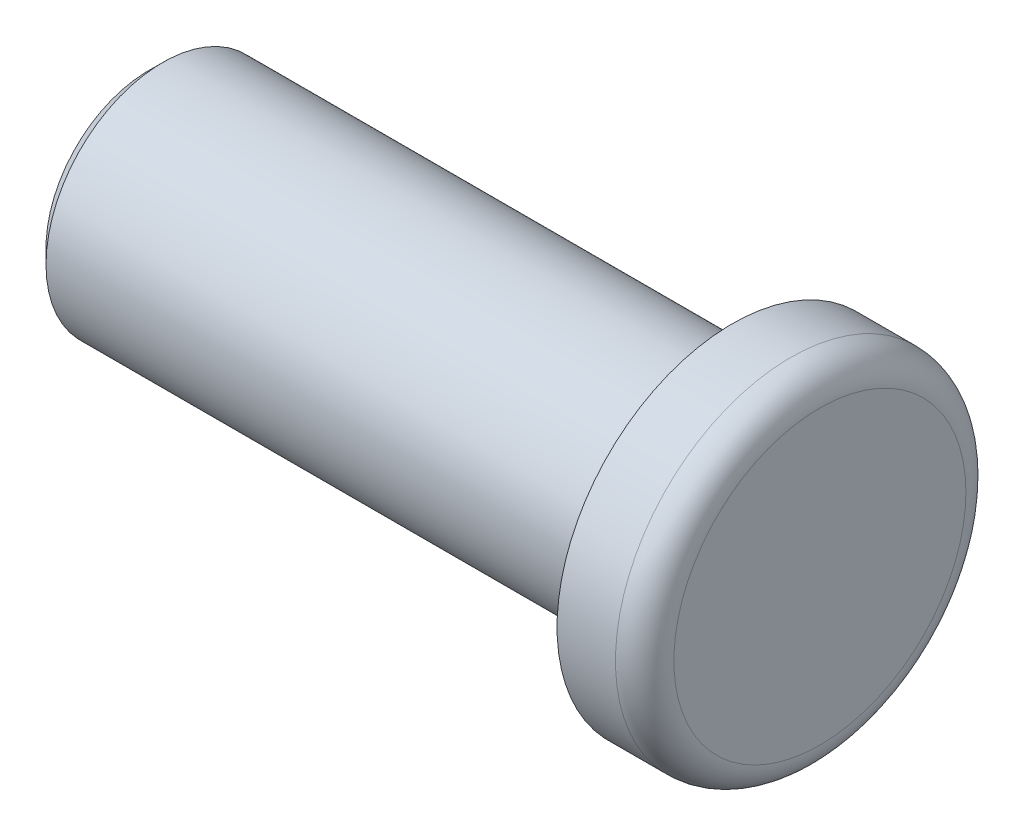
ISO-10303-21;
HEADER;
FILE_DESCRIPTION(('STEP AP214'),'2;1');
FILE_NAME('part.step','',(''),(''),'','','');
FILE_SCHEMA(('AUTOMOTIVE_DESIGN { 1 0 10303 214 1 1 1 1 }'));
ENDSEC;
DATA;
#1=APPLICATION_CONTEXT('core data for automotive mechanical design processes');
#2=APPLICATION_PROTOCOL_DEFINITION('international standard','automotive_design',2000,#1);
#3=PRODUCT_CONTEXT('',#1,'mechanical');
#4=PRODUCT('Part','Part','',(#3));
#5=PRODUCT_RELATED_PRODUCT_CATEGORY('part','',(#4));
#6=PRODUCT_DEFINITION_FORMATION('','',#4);
#7=PRODUCT_DEFINITION_CONTEXT('part definition',#1,'design');
#8=PRODUCT_DEFINITION('design','',#6,#7);
#9=PRODUCT_DEFINITION_SHAPE('','',#8);
#10=(LENGTH_UNIT() NAMED_UNIT(*) SI_UNIT(.MILLI.,.METRE.));
#11=(NAMED_UNIT(*) PLANE_ANGLE_UNIT() SI_UNIT($,.RADIAN.));
#12=(NAMED_UNIT(*) SI_UNIT($,.STERADIAN.) SOLID_ANGLE_UNIT());
#13=UNCERTAINTY_MEASURE_WITH_UNIT(LENGTH_MEASURE(1.E-05),#10,'distance_accuracy_value','');
#14=(GEOMETRIC_REPRESENTATION_CONTEXT(3) GLOBAL_UNCERTAINTY_ASSIGNED_CONTEXT((#13)) GLOBAL_UNIT_ASSIGNED_CONTEXT((#10,
#11,#12)) REPRESENTATION_CONTEXT('',''));
#15=CARTESIAN_POINT('',(0.,0.,0.));
#16=DIRECTION('',(0.,0.,1.));
#17=DIRECTION('',(1.,0.,0.));
#18=AXIS2_PLACEMENT_3D('',#15,#16,#17);
#19=CARTESIAN_POINT('',(3.,0.,0.));
#20=DIRECTION('',(1.,0.,0.));
#21=DIRECTION('',(0.,0.,-1.));
#22=AXIS2_PLACEMENT_3D('',#19,#20,#21);
#23=PLANE('',#22);
#24=CARTESIAN_POINT('',(3.,0.,0.));
#25=DIRECTION('',(1.,0.,0.));
#26=DIRECTION('',(0.,0.,-1.));
#27=AXIS2_PLACEMENT_3D('',#24,#25,#26);
#28=CIRCLE('',#27,5.);
#29=CARTESIAN_POINT('',(3.,0.,-5.));
#30=VERTEX_POINT('',#29);
#31=EDGE_CURVE('E64',#30,#30,#28,.T.);
#32=ORIENTED_EDGE('',*,*,#31,.T.);
#33=EDGE_LOOP('',(#32));
#34=FACE_BOUND('',#33,.T.);
#35=ADVANCED_FACE('F45',(#34),#23,.T.);
#36=CARTESIAN_POINT('',(0.,0.,0.));
#37=DIRECTION('',(1.,0.,0.));
#38=DIRECTION('',(0.,0.,-1.));
#39=AXIS2_PLACEMENT_3D('',#36,#37,#38);
#40=PLANE('',#39);
#41=CARTESIAN_POINT('',(0.,0.,0.));
#42=DIRECTION('',(1.,0.,0.));
#43=DIRECTION('',(0.,0.,-1.));
#44=AXIS2_PLACEMENT_3D('',#41,#42,#43);
#45=CIRCLE('',#44,6.);
#46=CARTESIAN_POINT('',(0.,0.,-6.));
#47=VERTEX_POINT('',#46);
#48=EDGE_CURVE('E70',#47,#47,#45,.T.);
#49=ORIENTED_EDGE('',*,*,#48,.F.);
#50=EDGE_LOOP('',(#49));
#51=FACE_BOUND('',#50,.T.);
#52=CARTESIAN_POINT('',(0.,0.,0.));
#53=DIRECTION('',(1.,0.,0.));
#54=DIRECTION('',(0.,0.,-1.));
#55=AXIS2_PLACEMENT_3D('',#52,#53,#54);
#56=CIRCLE('',#55,4.);
#57=CARTESIAN_POINT('',(0.,0.,-4.));
#58=VERTEX_POINT('',#57);
#59=EDGE_CURVE('E74',#58,#58,#56,.T.);
#60=ORIENTED_EDGE('',*,*,#59,.T.);
#61=EDGE_LOOP('',(#60));
#62=FACE_BOUND('',#61,.T.);
#63=ADVANCED_FACE('F79',(#51,#62),#40,.F.);
#64=CARTESIAN_POINT('',(3.,0.,0.));
#65=DIRECTION('',(-1.,0.,0.));
#66=DIRECTION('',(0.,0.,1.));
#67=AXIS2_PLACEMENT_3D('',#64,#65,#66);
#68=CYLINDRICAL_SURFACE('',#67,6.);
#69=CARTESIAN_POINT('',(2.,0.,0.));
#70=DIRECTION('',(1.,0.,0.));
#71=DIRECTION('',(0.,0.,-1.));
#72=AXIS2_PLACEMENT_3D('',#69,#70,#71);
#73=CIRCLE('',#72,6.);
#74=CARTESIAN_POINT('',(2.,0.,-6.));
#75=VERTEX_POINT('',#74);
#76=EDGE_CURVE('E59',#75,#75,#73,.F.);
#77=ORIENTED_EDGE('',*,*,#76,.T.);
#78=EDGE_LOOP('',(#77));
#79=FACE_BOUND('',#78,.T.);
#80=ORIENTED_EDGE('',*,*,#48,.T.);
#81=EDGE_LOOP('',(#80));
#82=FACE_BOUND('',#81,.T.);
#83=ADVANCED_FACE('F84',(#79,#82),#68,.T.);
#84=CARTESIAN_POINT('',(-20.,0.,0.));
#85=DIRECTION('',(1.,0.,0.));
#86=DIRECTION('',(0.,0.,-1.));
#87=AXIS2_PLACEMENT_3D('',#84,#85,#86);
#88=CYLINDRICAL_SURFACE('',#87,4.);
#89=CARTESIAN_POINT('',(-19.5,0.,0.));
#90=DIRECTION('',(1.,0.,0.));
#91=DIRECTION('',(0.,0.,-1.));
#92=AXIS2_PLACEMENT_3D('',#89,#90,#91);
#93=CIRCLE('',#92,4.);
#94=CARTESIAN_POINT('',(-19.5,0.,-4.));
#95=VERTEX_POINT('',#94);
#96=EDGE_CURVE('E54',#95,#95,#93,.T.);
#97=ORIENTED_EDGE('',*,*,#96,.T.);
#98=EDGE_LOOP('',(#97));
#99=FACE_BOUND('',#98,.T.);
#100=ORIENTED_EDGE('',*,*,#59,.F.);
#101=EDGE_LOOP('',(#100));
#102=FACE_BOUND('',#101,.T.);
#103=ADVANCED_FACE('F81',(#99,#102),#88,.T.);
#104=CARTESIAN_POINT('',(-20.,0.,0.));
#105=DIRECTION('',(1.,0.,0.));
#106=DIRECTION('',(0.,0.,-1.));
#107=AXIS2_PLACEMENT_3D('',#104,#105,#106);
#108=PLANE('',#107);
#109=CARTESIAN_POINT('',(-20.,0.,0.));
#110=DIRECTION('',(1.,0.,0.));
#111=DIRECTION('',(0.,0.,-1.));
#112=AXIS2_PLACEMENT_3D('',#109,#110,#111);
#113=CIRCLE('',#112,3.5);
#114=CARTESIAN_POINT('',(-20.,0.,-3.5));
#115=VERTEX_POINT('',#114);
#116=EDGE_CURVE('E10',#115,#115,#113,.F.);
#117=ORIENTED_EDGE('',*,*,#116,.T.);
#118=EDGE_LOOP('',(#117));
#119=FACE_BOUND('',#118,.T.);
#120=ADVANCED_FACE('F83',(#119),#108,.F.);
#121=CARTESIAN_POINT('',(2.,0.,0.));
#122=DIRECTION('',(1.,0.,0.));
#123=DIRECTION('',(0.,0.,-1.));
#124=AXIS2_PLACEMENT_3D('',#121,#122,#123);
#125=TOROIDAL_SURFACE('',#124,5.,1.);
#126=ORIENTED_EDGE('',*,*,#76,.F.);
#127=EDGE_LOOP('',(#126));
#128=FACE_BOUND('',#127,.T.);
#129=ORIENTED_EDGE('',*,*,#31,.F.);
#130=EDGE_LOOP('',(#129));
#131=FACE_BOUND('',#130,.T.);
#132=ADVANCED_FACE('F90',(#128,#131),#125,.T.);
#133=CARTESIAN_POINT('',(-19.5,0.,0.));
#134=DIRECTION('',(1.,0.,0.));
#135=DIRECTION('',(0.,0.,-1.));
#136=AXIS2_PLACEMENT_3D('',#133,#134,#135);
#137=CONICAL_SURFACE('',#136,4.,0.785398163397452);
#138=ORIENTED_EDGE('',*,*,#116,.F.);
#139=EDGE_LOOP('',(#138));
#140=FACE_BOUND('',#139,.T.);
#141=ORIENTED_EDGE('',*,*,#96,.F.);
#142=EDGE_LOOP('',(#141));
#143=FACE_BOUND('',#142,.T.);
#144=ADVANCED_FACE('F48',(#140,#143),#137,.T.);
#145=CLOSED_SHELL('',(#35,#63,#83,#103,#120,#132,#144));
#146=MANIFOLD_SOLID_BREP('B2',#145);
#147=ADVANCED_BREP_SHAPE_REPRESENTATION('',(#18,#146),#14);
#148=SHAPE_DEFINITION_REPRESENTATION(#9,#147);
ENDSEC;
END-ISO-10303-21;
